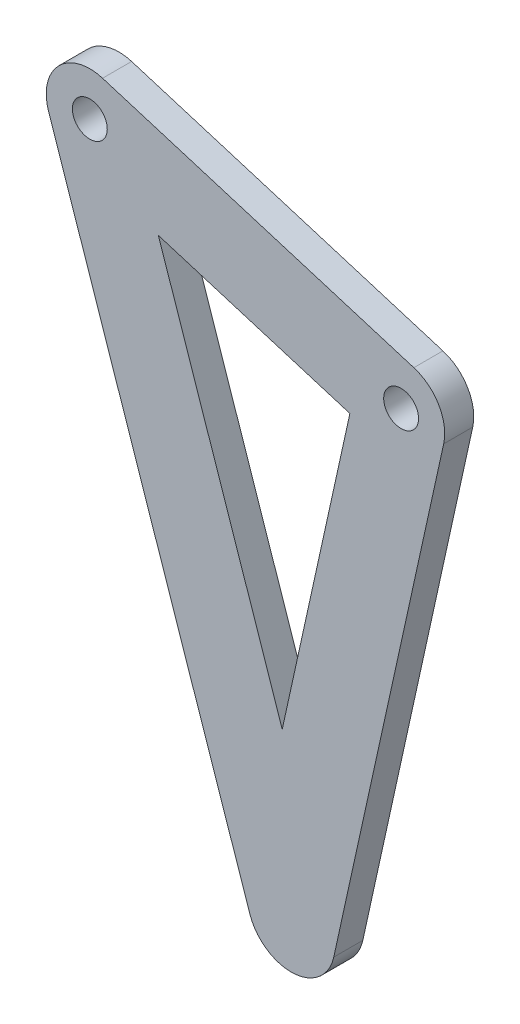
ISO-10303-21;
HEADER;
FILE_DESCRIPTION(('STEP AP214'),'2;1');
FILE_NAME('part.step','',(''),(''),'','','');
FILE_SCHEMA(('AUTOMOTIVE_DESIGN { 1 0 10303 214 1 1 1 1 }'));
ENDSEC;
DATA;
#1=APPLICATION_CONTEXT('core data for automotive mechanical design processes');
#2=APPLICATION_PROTOCOL_DEFINITION('international standard','automotive_design',2000,#1);
#3=PRODUCT_CONTEXT('',#1,'mechanical');
#4=PRODUCT('Part','Part','',(#3));
#5=PRODUCT_RELATED_PRODUCT_CATEGORY('part','',(#4));
#6=PRODUCT_DEFINITION_FORMATION('','',#4);
#7=PRODUCT_DEFINITION_CONTEXT('part definition',#1,'design');
#8=PRODUCT_DEFINITION('design','',#6,#7);
#9=PRODUCT_DEFINITION_SHAPE('','',#8);
#10=(LENGTH_UNIT() NAMED_UNIT(*) SI_UNIT(.MILLI.,.METRE.));
#11=(NAMED_UNIT(*) PLANE_ANGLE_UNIT() SI_UNIT($,.RADIAN.));
#12=(NAMED_UNIT(*) SI_UNIT($,.STERADIAN.) SOLID_ANGLE_UNIT());
#13=UNCERTAINTY_MEASURE_WITH_UNIT(LENGTH_MEASURE(1.E-05),#10,'distance_accuracy_value','');
#14=(GEOMETRIC_REPRESENTATION_CONTEXT(3) GLOBAL_UNCERTAINTY_ASSIGNED_CONTEXT((#13)) GLOBAL_UNIT_ASSIGNED_CONTEXT((#10,
#11,#12)) REPRESENTATION_CONTEXT('',''));
#15=CARTESIAN_POINT('',(0.,0.,0.));
#16=DIRECTION('',(0.,0.,1.));
#17=DIRECTION('',(1.,0.,0.));
#18=AXIS2_PLACEMENT_3D('',#15,#16,#17);
#19=CARTESIAN_POINT('',(-43.7165346615783,9.62173904858601,-5.));
#20=DIRECTION('',(-0.976625235753935,0.214949177454975,0.));
#21=DIRECTION('',(-0.214949177454975,-0.976625235753935,0.));
#22=AXIS2_PLACEMENT_3D('',#19,#20,#21);
#23=PLANE('',#22);
#24=DIRECTION('',(-0.214949177454975,-0.976625235753935,0.));
#25=VECTOR('',#24,1.);
#26=CARTESIAN_POINT('',(-43.7165346615783,9.62173904858601,0.));
#27=LINE('',#26,#25);
#28=CARTESIAN_POINT('',(-59.8382349069195,-63.6274796238543,0.));
#29=VERTEX_POINT('',#28);
#30=CARTESIAN_POINT('',(-71.4761668283359,-116.504620820742,0.));
#31=VERTEX_POINT('',#30);
#32=EDGE_CURVE('E156',#29,#31,#27,.T.);
#33=ORIENTED_EDGE('',*,*,#32,.F.);
#34=DIRECTION('',(0.,0.,1.));
#35=VECTOR('',#34,1.);
#36=CARTESIAN_POINT('',(-59.8382349069195,-63.6274796238543,-5.));
#37=LINE('',#36,#35);
#38=CARTESIAN_POINT('',(-59.8382349069195,-63.6274796238543,-5.));
#39=VERTEX_POINT('',#38);
#40=EDGE_CURVE('E11',#39,#29,#37,.T.);
#41=ORIENTED_EDGE('',*,*,#40,.F.);
#42=DIRECTION('',(-0.214949177454975,-0.976625235753935,0.));
#43=VECTOR('',#42,1.);
#44=CARTESIAN_POINT('',(-43.7165346615783,9.62173904858601,-5.));
#45=LINE('',#44,#43);
#46=CARTESIAN_POINT('',(-71.4761668283359,-116.504620820742,-5.));
#47=VERTEX_POINT('',#46);
#48=EDGE_CURVE('E127',#39,#47,#45,.T.);
#49=ORIENTED_EDGE('',*,*,#48,.T.);
#50=DIRECTION('',(0.,0.,1.));
#51=VECTOR('',#50,1.);
#52=CARTESIAN_POINT('',(-71.4761668283359,-116.504620820742,-5.));
#53=LINE('',#52,#51);
#54=EDGE_CURVE('E116',#47,#31,#53,.T.);
#55=ORIENTED_EDGE('',*,*,#54,.T.);
#56=EDGE_LOOP('',(#33,#41,#49,#55));
#57=FACE_BOUND('',#56,.T.);
#58=ADVANCED_FACE('F39',(#57),#23,.T.);
#59=CARTESIAN_POINT('',(-22.8674254979807,-74.9129424794934,-5.));
#60=DIRECTION('',(-0.291954153357193,-0.956432314561509,0.));
#61=DIRECTION('',(0.956432314561509,-0.291954153357193,0.));
#62=AXIS2_PLACEMENT_3D('',#59,#60,#61);
#63=PLANE('',#62);
#64=DIRECTION('',(0.956432314561509,-0.291954153357193,0.));
#65=VECTOR('',#64,1.);
#66=CARTESIAN_POINT('',(-22.8674254979807,-74.9129424794934,0.));
#67=LINE('',#66,#65);
#68=CARTESIAN_POINT('',(-92.7915886728931,-53.5683584999139,0.));
#69=VERTEX_POINT('',#68);
#70=EDGE_CURVE('E159',#69,#29,#67,.T.);
#71=ORIENTED_EDGE('',*,*,#70,.F.);
#72=DIRECTION('',(0.,0.,1.));
#73=VECTOR('',#72,1.);
#74=CARTESIAN_POINT('',(-92.7915886728931,-53.5683584999139,-5.));
#75=LINE('',#74,#73);
#76=CARTESIAN_POINT('',(-92.7915886728931,-53.5683584999139,-5.));
#77=VERTEX_POINT('',#76);
#78=EDGE_CURVE('E49',#77,#69,#75,.T.);
#79=ORIENTED_EDGE('',*,*,#78,.F.);
#80=DIRECTION('',(0.956432314561509,-0.291954153357193,0.));
#81=VECTOR('',#80,1.);
#82=CARTESIAN_POINT('',(-22.8674254979807,-74.9129424794934,-5.));
#83=LINE('',#82,#81);
#84=EDGE_CURVE('E128',#77,#39,#83,.T.);
#85=ORIENTED_EDGE('',*,*,#84,.T.);
#86=ORIENTED_EDGE('',*,*,#40,.T.);
#87=EDGE_LOOP('',(#71,#79,#85,#86));
#88=FACE_BOUND('',#87,.T.);
#89=ADVANCED_FACE('F228',(#88),#63,.T.);
#90=CARTESIAN_POINT('',(-113.7261431907,-38.5170746954583,-5.));
#91=DIRECTION('',(0.947152345688417,0.320784092587099,0.));
#92=DIRECTION('',(-0.320784092587099,0.947152345688417,0.));
#93=AXIS2_PLACEMENT_3D('',#90,#91,#92);
#94=PLANE('',#93);
#95=DIRECTION('',(-0.320784092587099,0.947152345688417,0.));
#96=VECTOR('',#95,1.);
#97=CARTESIAN_POINT('',(-113.7261431907,-38.5170746954583,0.));
#98=LINE('',#97,#96);
#99=CARTESIAN_POINT('',(-77.0441167281115,-146.825024533127,0.));
#100=VERTEX_POINT('',#99);
#101=CARTESIAN_POINT('',(-111.688798727518,-44.5325711987778,0.));
#102=VERTEX_POINT('',#101);
#103=EDGE_CURVE('E138',#100,#102,#98,.T.);
#104=ORIENTED_EDGE('',*,*,#103,.T.);
#105=DIRECTION('',(0.,0.,1.));
#106=VECTOR('',#105,1.);
#107=CARTESIAN_POINT('',(-111.688798727518,-44.5325711987778,-5.));
#108=LINE('',#107,#106);
#109=CARTESIAN_POINT('',(-111.688798727518,-44.5325711987778,-5.));
#110=VERTEX_POINT('',#109);
#111=EDGE_CURVE('E123',#110,#102,#108,.T.);
#112=ORIENTED_EDGE('',*,*,#111,.F.);
#113=DIRECTION('',(-0.320784092587099,0.947152345688417,0.));
#114=VECTOR('',#113,1.);
#115=CARTESIAN_POINT('',(-113.7261431907,-38.5170746954583,-5.));
#116=LINE('',#115,#114);
#117=CARTESIAN_POINT('',(-77.0441167281115,-146.825024533127,-5.));
#118=VERTEX_POINT('',#117);
#119=EDGE_CURVE('E161',#118,#110,#116,.T.);
#120=ORIENTED_EDGE('',*,*,#119,.F.);
#121=DIRECTION('',(0.,0.,1.));
#122=VECTOR('',#121,1.);
#123=CARTESIAN_POINT('',(-77.0441167281115,-146.825024533127,-5.));
#124=LINE('',#123,#122);
#125=EDGE_CURVE('E99',#118,#100,#124,.T.);
#126=ORIENTED_EDGE('',*,*,#125,.T.);
#127=EDGE_LOOP('',(#104,#112,#120,#126));
#128=FACE_BOUND('',#127,.T.);
#129=ADVANCED_FACE('F41',(#128),#94,.F.);
#130=CARTESIAN_POINT('',(-104.585156134855,-42.1266905043745,-5.));
#131=DIRECTION('',(0.,0.,1.));
#132=DIRECTION('',(1.,0.,0.));
#133=AXIS2_PLACEMENT_3D('',#130,#131,#132);
#134=CYLINDRICAL_SURFACE('',#133,7.49999999999998);
#135=CARTESIAN_POINT('',(-104.585156134855,-42.1266905043745,0.));
#136=DIRECTION('',(0.,0.,1.));
#137=DIRECTION('',(1.,0.,0.));
#138=AXIS2_PLACEMENT_3D('',#135,#136,#137);
#139=CIRCLE('',#138,7.49999999999998);
#140=CARTESIAN_POINT('',(-102.395499984676,-34.9534481451632,0.));
#141=VERTEX_POINT('',#140);
#142=EDGE_CURVE('E153',#141,#102,#139,.T.);
#143=ORIENTED_EDGE('',*,*,#142,.F.);
#144=DIRECTION('',(0.,0.,1.));
#145=VECTOR('',#144,1.);
#146=CARTESIAN_POINT('',(-102.395499984676,-34.9534481451632,-5.));
#147=LINE('',#146,#145);
#148=CARTESIAN_POINT('',(-102.395499984676,-34.9534481451632,-5.));
#149=VERTEX_POINT('',#148);
#150=EDGE_CURVE('E165',#149,#141,#147,.T.);
#151=ORIENTED_EDGE('',*,*,#150,.F.);
#152=CARTESIAN_POINT('',(-104.585156134855,-42.1266905043745,-5.));
#153=DIRECTION('',(0.,0.,1.));
#154=DIRECTION('',(1.,0.,0.));
#155=AXIS2_PLACEMENT_3D('',#152,#153,#154);
#156=CIRCLE('',#155,7.49999999999998);
#157=EDGE_CURVE('E130',#149,#110,#156,.T.);
#158=ORIENTED_EDGE('',*,*,#157,.T.);
#159=ORIENTED_EDGE('',*,*,#111,.T.);
#160=EDGE_LOOP('',(#143,#151,#158,#159));
#161=FACE_BOUND('',#160,.T.);
#162=ADVANCED_FACE('F220',(#161),#134,.T.);
#163=CARTESIAN_POINT('',(-18.4881131976228,-60.5664577610708,-5.));
#164=DIRECTION('',(-0.291954153357192,-0.956432314561509,0.));
#165=DIRECTION('',(0.956432314561509,-0.291954153357192,0.));
#166=AXIS2_PLACEMENT_3D('',#163,#164,#165);
#167=PLANE('',#166);
#168=DIRECTION('',(0.956432314561509,-0.291954153357192,0.));
#169=VECTOR('',#168,1.);
#170=CARTESIAN_POINT('',(-18.4881131976228,-60.5664577610708,0.));
#171=LINE('',#170,#169);
#172=CARTESIAN_POINT('',(-48.8352903692317,-51.302880733166,0.));
#173=VERTEX_POINT('',#172);
#174=EDGE_CURVE('E150',#141,#173,#171,.T.);
#175=ORIENTED_EDGE('',*,*,#174,.T.);
#176=DIRECTION('',(0.,0.,1.));
#177=VECTOR('',#176,1.);
#178=CARTESIAN_POINT('',(-48.8352903692317,-51.302880733166,-5.));
#179=LINE('',#178,#177);
#180=CARTESIAN_POINT('',(-48.8352903692317,-51.302880733166,-5.));
#181=VERTEX_POINT('',#180);
#182=EDGE_CURVE('E167',#181,#173,#179,.T.);
#183=ORIENTED_EDGE('',*,*,#182,.F.);
#184=DIRECTION('',(0.956432314561509,-0.291954153357192,0.));
#185=VECTOR('',#184,1.);
#186=CARTESIAN_POINT('',(-18.4881131976228,-60.5664577610708,-5.));
#187=LINE('',#186,#185);
#188=EDGE_CURVE('E133',#149,#181,#187,.T.);
#189=ORIENTED_EDGE('',*,*,#188,.F.);
#190=ORIENTED_EDGE('',*,*,#150,.T.);
#191=EDGE_LOOP('',(#175,#183,#189,#190));
#192=FACE_BOUND('',#191,.T.);
#193=ADVANCED_FACE('F200',(#192),#167,.F.);
#194=CARTESIAN_POINT('',(-51.0249465194106,-58.4761230923773,-5.));
#195=DIRECTION('',(0.,0.,1.));
#196=DIRECTION('',(1.,0.,0.));
#197=AXIS2_PLACEMENT_3D('',#194,#195,#196);
#198=CYLINDRICAL_SURFACE('',#197,7.5);
#199=CARTESIAN_POINT('',(-51.0249465194106,-58.4761230923773,0.));
#200=DIRECTION('',(0.,0.,1.));
#201=DIRECTION('',(1.,0.,0.));
#202=AXIS2_PLACEMENT_3D('',#199,#200,#201);
#203=CIRCLE('',#202,7.5);
#204=CARTESIAN_POINT('',(-43.7002572512561,-60.0882419232896,0.));
#205=VERTEX_POINT('',#204);
#206=EDGE_CURVE('E147',#205,#173,#203,.T.);
#207=ORIENTED_EDGE('',*,*,#206,.F.);
#208=DIRECTION('',(0.,0.,1.));
#209=VECTOR('',#208,1.);
#210=CARTESIAN_POINT('',(-43.7002572512561,-60.0882419232896,-5.));
#211=LINE('',#210,#209);
#212=CARTESIAN_POINT('',(-43.7002572512561,-60.0882419232896,-5.));
#213=VERTEX_POINT('',#212);
#214=EDGE_CURVE('E169',#213,#205,#211,.T.);
#215=ORIENTED_EDGE('',*,*,#214,.F.);
#216=CARTESIAN_POINT('',(-51.0249465194106,-58.4761230923773,-5.));
#217=DIRECTION('',(0.,0.,1.));
#218=DIRECTION('',(1.,0.,0.));
#219=AXIS2_PLACEMENT_3D('',#216,#217,#218);
#220=CIRCLE('',#219,7.5);
#221=EDGE_CURVE('E192',#213,#181,#220,.T.);
#222=ORIENTED_EDGE('',*,*,#221,.T.);
#223=ORIENTED_EDGE('',*,*,#182,.T.);
#224=EDGE_LOOP('',(#207,#215,#222,#223));
#225=FACE_BOUND('',#224,.T.);
#226=ADVANCED_FACE('F204',(#225),#198,.T.);
#227=CARTESIAN_POINT('',(-29.0671561252692,6.39750138676138,-5.));
#228=DIRECTION('',(-0.976625235753935,0.214949177454975,0.));
#229=DIRECTION('',(-0.214949177454975,-0.976625235753935,0.));
#230=AXIS2_PLACEMENT_3D('',#227,#228,#229);
#231=PLANE('',#230);
#232=DIRECTION('',(-0.214949177454975,-0.976625235753935,0.));
#233=VECTOR('',#232,1.);
#234=CARTESIAN_POINT('',(-29.0671561252692,6.39750138676138,0.));
#235=LINE('',#234,#233);
#236=CARTESIAN_POINT('',(-62.6157848672939,-146.031262669636,0.));
#237=VERTEX_POINT('',#236);
#238=EDGE_CURVE('E144',#205,#237,#235,.T.);
#239=ORIENTED_EDGE('',*,*,#238,.T.);
#240=DIRECTION('',(0.,0.,1.));
#241=VECTOR('',#240,1.);
#242=CARTESIAN_POINT('',(-62.6157848672939,-146.031262669636,-5.));
#243=LINE('',#242,#241);
#244=CARTESIAN_POINT('',(-62.6157848672939,-146.031262669636,-5.));
#245=VERTEX_POINT('',#244);
#246=EDGE_CURVE('E171',#245,#237,#243,.T.);
#247=ORIENTED_EDGE('',*,*,#246,.F.);
#248=DIRECTION('',(-0.214949177454975,-0.976625235753935,0.));
#249=VECTOR('',#248,1.);
#250=CARTESIAN_POINT('',(-29.0671561252692,6.39750138676138,-5.));
#251=LINE('',#250,#249);
#252=EDGE_CURVE('E190',#213,#245,#251,.T.);
#253=ORIENTED_EDGE('',*,*,#252,.F.);
#254=ORIENTED_EDGE('',*,*,#214,.T.);
#255=EDGE_LOOP('',(#239,#247,#253,#254));
#256=FACE_BOUND('',#255,.T.);
#257=ADVANCED_FACE('F209',(#256),#231,.F.);
#258=CARTESIAN_POINT('',(-69.9404741354484,-144.419143838724,-5.));
#259=DIRECTION('',(0.,0.,1.));
#260=DIRECTION('',(1.,0.,0.));
#261=AXIS2_PLACEMENT_3D('',#258,#259,#260);
#262=CYLINDRICAL_SURFACE('',#261,7.49999999999999);
#263=CARTESIAN_POINT('',(-69.9404741354484,-144.419143838724,0.));
#264=DIRECTION('',(0.,0.,1.));
#265=DIRECTION('',(1.,0.,0.));
#266=AXIS2_PLACEMENT_3D('',#263,#264,#265);
#267=CIRCLE('',#266,7.49999999999999);
#268=EDGE_CURVE('E141',#100,#237,#267,.T.);
#269=ORIENTED_EDGE('',*,*,#268,.F.);
#270=ORIENTED_EDGE('',*,*,#125,.F.);
#271=CARTESIAN_POINT('',(-69.9404741354484,-144.419143838724,-5.));
#272=DIRECTION('',(0.,0.,1.));
#273=DIRECTION('',(1.,0.,0.));
#274=AXIS2_PLACEMENT_3D('',#271,#272,#273);
#275=CIRCLE('',#274,7.49999999999999);
#276=EDGE_CURVE('E188',#118,#245,#275,.T.);
#277=ORIENTED_EDGE('',*,*,#276,.T.);
#278=ORIENTED_EDGE('',*,*,#246,.T.);
#279=EDGE_LOOP('',(#269,#270,#277,#278));
#280=FACE_BOUND('',#279,.T.);
#281=ADVANCED_FACE('F212',(#280),#262,.T.);
#282=CARTESIAN_POINT('',(-99.5188580053741,-33.7053133066518,-5.));
#283=DIRECTION('',(0.947152345688418,0.320784092587099,0.));
#284=DIRECTION('',(-0.320784092587099,0.947152345688418,0.));
#285=AXIS2_PLACEMENT_3D('',#282,#283,#284);
#286=PLANE('',#285);
#287=DIRECTION('',(-0.320784092587099,0.947152345688417,0.));
#288=VECTOR('',#287,1.);
#289=CARTESIAN_POINT('',(-99.5188580053741,-33.7053133066518,0.));
#290=LINE('',#289,#288);
#291=EDGE_CURVE('E121',#31,#69,#290,.T.);
#292=ORIENTED_EDGE('',*,*,#291,.F.);
#293=ORIENTED_EDGE('',*,*,#54,.F.);
#294=DIRECTION('',(-0.320784092587099,0.947152345688417,0.));
#295=VECTOR('',#294,1.);
#296=CARTESIAN_POINT('',(-99.5188580053741,-33.7053133066518,-5.));
#297=LINE('',#296,#295);
#298=EDGE_CURVE('E119',#47,#77,#297,.T.);
#299=ORIENTED_EDGE('',*,*,#298,.T.);
#300=ORIENTED_EDGE('',*,*,#78,.T.);
#301=EDGE_LOOP('',(#292,#293,#299,#300));
#302=FACE_BOUND('',#301,.T.);
#303=ADVANCED_FACE('F118',(#302),#286,.T.);
#304=CARTESIAN_POINT('',(0.,0.,-5.));
#305=DIRECTION('',(0.,0.,1.));
#306=DIRECTION('',(1.,0.,0.));
#307=AXIS2_PLACEMENT_3D('',#304,#305,#306);
#308=PLANE('',#307);
#309=CARTESIAN_POINT('',(-104.585156134855,-42.1266905043745,-5.));
#310=DIRECTION('',(0.,0.,1.));
#311=DIRECTION('',(1.,0.,0.));
#312=AXIS2_PLACEMENT_3D('',#309,#310,#311);
#313=CIRCLE('',#312,2.99999999999999);
#314=CARTESIAN_POINT('',(-101.585156134855,-42.1266905043745,-5.));
#315=VERTEX_POINT('',#314);
#316=EDGE_CURVE('E175',#315,#315,#313,.T.);
#317=ORIENTED_EDGE('',*,*,#316,.T.);
#318=EDGE_LOOP('',(#317));
#319=FACE_BOUND('',#318,.T.);
#320=CARTESIAN_POINT('',(-51.0249465194106,-58.4761230923773,-5.));
#321=DIRECTION('',(0.,0.,1.));
#322=DIRECTION('',(1.,0.,0.));
#323=AXIS2_PLACEMENT_3D('',#320,#321,#322);
#324=CIRCLE('',#323,3.00000000000001);
#325=CARTESIAN_POINT('',(-48.0249465194106,-58.4761230923773,-5.));
#326=VERTEX_POINT('',#325);
#327=EDGE_CURVE('E180',#326,#326,#324,.T.);
#328=ORIENTED_EDGE('',*,*,#327,.T.);
#329=EDGE_LOOP('',(#328));
#330=FACE_BOUND('',#329,.T.);
#331=ORIENTED_EDGE('',*,*,#119,.T.);
#332=ORIENTED_EDGE('',*,*,#157,.F.);
#333=ORIENTED_EDGE('',*,*,#188,.T.);
#334=ORIENTED_EDGE('',*,*,#221,.F.);
#335=ORIENTED_EDGE('',*,*,#252,.T.);
#336=ORIENTED_EDGE('',*,*,#276,.F.);
#337=EDGE_LOOP('',(#331,#332,#333,#334,#335,#336));
#338=FACE_BOUND('',#337,.T.);
#339=ORIENTED_EDGE('',*,*,#48,.F.);
#340=ORIENTED_EDGE('',*,*,#84,.F.);
#341=ORIENTED_EDGE('',*,*,#298,.F.);
#342=EDGE_LOOP('',(#339,#340,#341));
#343=FACE_BOUND('',#342,.T.);
#344=ADVANCED_FACE('F126',(#319,#330,#338,#343),#308,.F.);
#345=CARTESIAN_POINT('',(0.,0.,0.));
#346=DIRECTION('',(0.,0.,1.));
#347=DIRECTION('',(1.,0.,0.));
#348=AXIS2_PLACEMENT_3D('',#345,#346,#347);
#349=PLANE('',#348);
#350=CARTESIAN_POINT('',(-104.585156134855,-42.1266905043745,0.));
#351=DIRECTION('',(0.,0.,1.));
#352=DIRECTION('',(1.,0.,0.));
#353=AXIS2_PLACEMENT_3D('',#350,#351,#352);
#354=CIRCLE('',#353,2.99999999999999);
#355=CARTESIAN_POINT('',(-101.585156134855,-42.1266905043745,0.));
#356=VERTEX_POINT('',#355);
#357=EDGE_CURVE('E43',#356,#356,#354,.T.);
#358=ORIENTED_EDGE('',*,*,#357,.F.);
#359=EDGE_LOOP('',(#358));
#360=FACE_BOUND('',#359,.T.);
#361=CARTESIAN_POINT('',(-51.0249465194106,-58.4761230923773,0.));
#362=DIRECTION('',(0.,0.,1.));
#363=DIRECTION('',(1.,0.,0.));
#364=AXIS2_PLACEMENT_3D('',#361,#362,#363);
#365=CIRCLE('',#364,3.00000000000001);
#366=CARTESIAN_POINT('',(-48.0249465194106,-58.4761230923773,0.));
#367=VERTEX_POINT('',#366);
#368=EDGE_CURVE('E173',#367,#367,#365,.T.);
#369=ORIENTED_EDGE('',*,*,#368,.F.);
#370=EDGE_LOOP('',(#369));
#371=FACE_BOUND('',#370,.T.);
#372=ORIENTED_EDGE('',*,*,#103,.F.);
#373=ORIENTED_EDGE('',*,*,#268,.T.);
#374=ORIENTED_EDGE('',*,*,#238,.F.);
#375=ORIENTED_EDGE('',*,*,#206,.T.);
#376=ORIENTED_EDGE('',*,*,#174,.F.);
#377=ORIENTED_EDGE('',*,*,#142,.T.);
#378=EDGE_LOOP('',(#372,#373,#374,#375,#376,#377));
#379=FACE_BOUND('',#378,.T.);
#380=ORIENTED_EDGE('',*,*,#32,.T.);
#381=ORIENTED_EDGE('',*,*,#291,.T.);
#382=ORIENTED_EDGE('',*,*,#70,.T.);
#383=EDGE_LOOP('',(#380,#381,#382));
#384=FACE_BOUND('',#383,.T.);
#385=ADVANCED_FACE('F215',(#360,#371,#379,#384),#349,.T.);
#386=CARTESIAN_POINT('',(-51.0249465194106,-58.4761230923773,-5.));
#387=DIRECTION('',(0.,0.,1.));
#388=DIRECTION('',(1.,0.,0.));
#389=AXIS2_PLACEMENT_3D('',#386,#387,#388);
#390=CYLINDRICAL_SURFACE('',#389,3.00000000000001);
#391=ORIENTED_EDGE('',*,*,#368,.T.);
#392=EDGE_LOOP('',(#391));
#393=FACE_BOUND('',#392,.T.);
#394=ORIENTED_EDGE('',*,*,#327,.F.);
#395=EDGE_LOOP('',(#394));
#396=FACE_BOUND('',#395,.T.);
#397=ADVANCED_FACE('F240',(#393,#396),#390,.F.);
#398=CARTESIAN_POINT('',(-104.585156134855,-42.1266905043745,-5.));
#399=DIRECTION('',(0.,0.,1.));
#400=DIRECTION('',(1.,0.,0.));
#401=AXIS2_PLACEMENT_3D('',#398,#399,#400);
#402=CYLINDRICAL_SURFACE('',#401,2.99999999999999);
#403=ORIENTED_EDGE('',*,*,#357,.T.);
#404=EDGE_LOOP('',(#403));
#405=FACE_BOUND('',#404,.T.);
#406=ORIENTED_EDGE('',*,*,#316,.F.);
#407=EDGE_LOOP('',(#406));
#408=FACE_BOUND('',#407,.T.);
#409=ADVANCED_FACE('F246',(#405,#408),#402,.F.);
#410=CLOSED_SHELL('',(#58,#89,#129,#162,#193,#226,#257,#281,#303,#344,#385,#397,#409));
#411=MANIFOLD_SOLID_BREP('B2',#410);
#412=ADVANCED_BREP_SHAPE_REPRESENTATION('',(#18,#411),#14);
#413=SHAPE_DEFINITION_REPRESENTATION(#9,#412);
ENDSEC;
END-ISO-10303-21;
